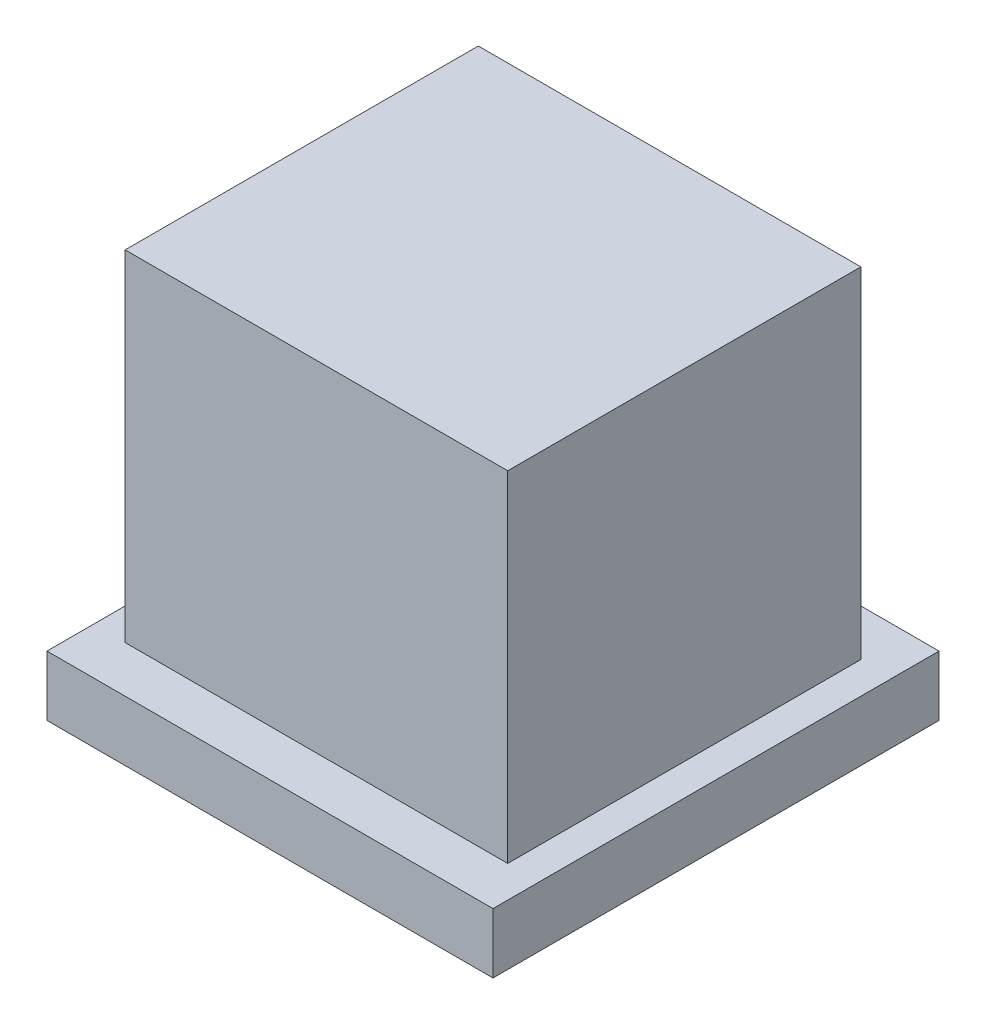
ISO-10303-21;
HEADER;
FILE_DESCRIPTION(('STEP AP214'),'2;1');
FILE_NAME('part.step','',(''),(''),'','','');
FILE_SCHEMA(('AUTOMOTIVE_DESIGN { 1 0 10303 214 1 1 1 1 }'));
ENDSEC;
DATA;
#1=APPLICATION_CONTEXT('core data for automotive mechanical design processes');
#2=APPLICATION_PROTOCOL_DEFINITION('international standard','automotive_design',2000,#1);
#3=PRODUCT_CONTEXT('',#1,'mechanical');
#4=PRODUCT('Part','Part','',(#3));
#5=PRODUCT_RELATED_PRODUCT_CATEGORY('part','',(#4));
#6=PRODUCT_DEFINITION_FORMATION('','',#4);
#7=PRODUCT_DEFINITION_CONTEXT('part definition',#1,'design');
#8=PRODUCT_DEFINITION('design','',#6,#7);
#9=PRODUCT_DEFINITION_SHAPE('','',#8);
#10=(LENGTH_UNIT() NAMED_UNIT(*) SI_UNIT(.MILLI.,.METRE.));
#11=(NAMED_UNIT(*) PLANE_ANGLE_UNIT() SI_UNIT($,.RADIAN.));
#12=(NAMED_UNIT(*) SI_UNIT($,.STERADIAN.) SOLID_ANGLE_UNIT());
#13=UNCERTAINTY_MEASURE_WITH_UNIT(LENGTH_MEASURE(1.E-05),#10,'distance_accuracy_value','');
#14=(GEOMETRIC_REPRESENTATION_CONTEXT(3) GLOBAL_UNCERTAINTY_ASSIGNED_CONTEXT((#13)) GLOBAL_UNIT_ASSIGNED_CONTEXT((#10,
#11,#12)) REPRESENTATION_CONTEXT('',''));
#15=CARTESIAN_POINT('',(0.,0.,0.));
#16=DIRECTION('',(0.,0.,1.));
#17=DIRECTION('',(1.,0.,0.));
#18=AXIS2_PLACEMENT_3D('',#15,#16,#17);
#19=CARTESIAN_POINT('',(0.,3.6322,0.));
#20=DIRECTION('',(1.,0.,0.));
#21=DIRECTION('',(0.,0.,-1.));
#22=AXIS2_PLACEMENT_3D('',#19,#20,#21);
#23=PLANE('',#22);
#24=DIRECTION('',(0.,0.,1.));
#25=VECTOR('',#24,1.);
#26=CARTESIAN_POINT('',(0.,0.,0.));
#27=LINE('',#26,#25);
#28=CARTESIAN_POINT('',(0.,0.,-26.9494));
#29=VERTEX_POINT('',#28);
#30=CARTESIAN_POINT('',(0.,0.,0.));
#31=VERTEX_POINT('',#30);
#32=EDGE_CURVE('E241',#29,#31,#27,.T.);
#33=ORIENTED_EDGE('',*,*,#32,.T.);
#34=DIRECTION('',(0.,-1.,0.));
#35=VECTOR('',#34,1.);
#36=CARTESIAN_POINT('',(0.,3.6322,0.));
#37=LINE('',#36,#35);
#38=CARTESIAN_POINT('',(0.,3.6322,0.));
#39=VERTEX_POINT('',#38);
#40=EDGE_CURVE('E11',#39,#31,#37,.T.);
#41=ORIENTED_EDGE('',*,*,#40,.F.);
#42=DIRECTION('',(0.,0.,1.));
#43=VECTOR('',#42,1.);
#44=CARTESIAN_POINT('',(0.,3.6322,0.));
#45=LINE('',#44,#43);
#46=CARTESIAN_POINT('',(0.,3.6322,-26.9494));
#47=VERTEX_POINT('',#46);
#48=EDGE_CURVE('E249',#47,#39,#45,.T.);
#49=ORIENTED_EDGE('',*,*,#48,.F.);
#50=DIRECTION('',(0.,-1.,0.));
#51=VECTOR('',#50,1.);
#52=CARTESIAN_POINT('',(0.,3.6322,-26.9494));
#53=LINE('',#52,#51);
#54=EDGE_CURVE('E259',#47,#29,#53,.T.);
#55=ORIENTED_EDGE('',*,*,#54,.T.);
#56=EDGE_LOOP('',(#33,#41,#49,#55));
#57=FACE_BOUND('',#56,.T.);
#58=ADVANCED_FACE('F32',(#57),#23,.F.);
#59=CARTESIAN_POINT('',(0.,3.6322,0.));
#60=DIRECTION('',(0.,0.,-1.));
#61=DIRECTION('',(-1.,0.,0.));
#62=AXIS2_PLACEMENT_3D('',#59,#60,#61);
#63=PLANE('',#62);
#64=DIRECTION('',(1.,0.,0.));
#65=VECTOR('',#64,1.);
#66=CARTESIAN_POINT('',(0.,0.,0.));
#67=LINE('',#66,#65);
#68=CARTESIAN_POINT('',(26.9494,0.,0.));
#69=VERTEX_POINT('',#68);
#70=EDGE_CURVE('E262',#31,#69,#67,.T.);
#71=ORIENTED_EDGE('',*,*,#70,.T.);
#72=DIRECTION('',(0.,-1.,0.));
#73=VECTOR('',#72,1.);
#74=CARTESIAN_POINT('',(26.9494,3.6322,0.));
#75=LINE('',#74,#73);
#76=CARTESIAN_POINT('',(26.9494,3.6322,0.));
#77=VERTEX_POINT('',#76);
#78=EDGE_CURVE('E39',#77,#69,#75,.T.);
#79=ORIENTED_EDGE('',*,*,#78,.F.);
#80=DIRECTION('',(1.,0.,0.));
#81=VECTOR('',#80,1.);
#82=CARTESIAN_POINT('',(0.,3.6322,0.));
#83=LINE('',#82,#81);
#84=EDGE_CURVE('E252',#39,#77,#83,.T.);
#85=ORIENTED_EDGE('',*,*,#84,.F.);
#86=ORIENTED_EDGE('',*,*,#40,.T.);
#87=EDGE_LOOP('',(#71,#79,#85,#86));
#88=FACE_BOUND('',#87,.T.);
#89=ADVANCED_FACE('F292',(#88),#63,.F.);
#90=CARTESIAN_POINT('',(26.9494,3.6322,0.));
#91=DIRECTION('',(-1.,0.,0.));
#92=DIRECTION('',(0.,0.,1.));
#93=AXIS2_PLACEMENT_3D('',#90,#91,#92);
#94=PLANE('',#93);
#95=DIRECTION('',(0.,0.,-1.));
#96=VECTOR('',#95,1.);
#97=CARTESIAN_POINT('',(26.9494,0.,0.));
#98=LINE('',#97,#96);
#99=CARTESIAN_POINT('',(26.9494,0.,-26.9494));
#100=VERTEX_POINT('',#99);
#101=EDGE_CURVE('E264',#69,#100,#98,.T.);
#102=ORIENTED_EDGE('',*,*,#101,.T.);
#103=DIRECTION('',(0.,-1.,0.));
#104=VECTOR('',#103,1.);
#105=CARTESIAN_POINT('',(26.9494,3.6322,-26.9494));
#106=LINE('',#105,#104);
#107=CARTESIAN_POINT('',(26.9494,3.6322,-26.9494));
#108=VERTEX_POINT('',#107);
#109=EDGE_CURVE('E269',#108,#100,#106,.T.);
#110=ORIENTED_EDGE('',*,*,#109,.F.);
#111=DIRECTION('',(0.,0.,-1.));
#112=VECTOR('',#111,1.);
#113=CARTESIAN_POINT('',(26.9494,3.6322,0.));
#114=LINE('',#113,#112);
#115=EDGE_CURVE('E255',#77,#108,#114,.T.);
#116=ORIENTED_EDGE('',*,*,#115,.F.);
#117=ORIENTED_EDGE('',*,*,#78,.T.);
#118=EDGE_LOOP('',(#102,#110,#116,#117));
#119=FACE_BOUND('',#118,.T.);
#120=ADVANCED_FACE('F276',(#119),#94,.F.);
#121=CARTESIAN_POINT('',(0.,3.6322,-26.9494));
#122=DIRECTION('',(0.,0.,1.));
#123=DIRECTION('',(1.,0.,0.));
#124=AXIS2_PLACEMENT_3D('',#121,#122,#123);
#125=PLANE('',#124);
#126=DIRECTION('',(-1.,0.,0.));
#127=VECTOR('',#126,1.);
#128=CARTESIAN_POINT('',(0.,0.,-26.9494));
#129=LINE('',#128,#127);
#130=EDGE_CURVE('E253',#100,#29,#129,.T.);
#131=ORIENTED_EDGE('',*,*,#130,.T.);
#132=ORIENTED_EDGE('',*,*,#54,.F.);
#133=DIRECTION('',(-1.,0.,0.));
#134=VECTOR('',#133,1.);
#135=CARTESIAN_POINT('',(0.,3.6322,-26.9494));
#136=LINE('',#135,#134);
#137=EDGE_CURVE('E257',#108,#47,#136,.T.);
#138=ORIENTED_EDGE('',*,*,#137,.F.);
#139=ORIENTED_EDGE('',*,*,#109,.T.);
#140=EDGE_LOOP('',(#131,#132,#138,#139));
#141=FACE_BOUND('',#140,.T.);
#142=ADVANCED_FACE('F285',(#141),#125,.F.);
#143=CARTESIAN_POINT('',(0.,3.6322,0.));
#144=DIRECTION('',(0.,-1.,0.));
#145=DIRECTION('',(0.,0.,-1.));
#146=AXIS2_PLACEMENT_3D('',#143,#144,#145);
#147=PLANE('',#146);
#148=DIRECTION('',(0.,0.,1.));
#149=VECTOR('',#148,1.);
#150=CARTESIAN_POINT('',(1.91769999999999,3.6322,-24.1427));
#151=LINE('',#150,#149);
#152=CARTESIAN_POINT('',(1.91769999999999,3.6322,-24.1427));
#153=VERTEX_POINT('',#152);
#154=CARTESIAN_POINT('',(1.9177,3.6322,-2.8067));
#155=VERTEX_POINT('',#154);
#156=EDGE_CURVE('E223',#153,#155,#151,.T.);
#157=ORIENTED_EDGE('',*,*,#156,.F.);
#158=DIRECTION('',(1.,0.,0.));
#159=VECTOR('',#158,1.);
#160=CARTESIAN_POINT('',(1.91769999999999,3.6322,-24.1427));
#161=LINE('',#160,#159);
#162=CARTESIAN_POINT('',(25.0317,3.6322,-24.1427));
#163=VERTEX_POINT('',#162);
#164=EDGE_CURVE('E213',#153,#163,#161,.T.);
#165=ORIENTED_EDGE('',*,*,#164,.T.);
#166=DIRECTION('',(0.,0.,1.));
#167=VECTOR('',#166,1.);
#168=CARTESIAN_POINT('',(25.0317,3.6322,-24.1427));
#169=LINE('',#168,#167);
#170=CARTESIAN_POINT('',(25.0317,3.6322,-2.8067));
#171=VERTEX_POINT('',#170);
#172=EDGE_CURVE('E233',#163,#171,#169,.T.);
#173=ORIENTED_EDGE('',*,*,#172,.T.);
#174=DIRECTION('',(1.,0.,0.));
#175=VECTOR('',#174,1.);
#176=CARTESIAN_POINT('',(1.9177,3.6322,-2.8067));
#177=LINE('',#176,#175);
#178=EDGE_CURVE('E236',#155,#171,#177,.T.);
#179=ORIENTED_EDGE('',*,*,#178,.F.);
#180=EDGE_LOOP('',(#157,#165,#173,#179));
#181=FACE_BOUND('',#180,.T.);
#182=ORIENTED_EDGE('',*,*,#48,.T.);
#183=ORIENTED_EDGE('',*,*,#84,.T.);
#184=ORIENTED_EDGE('',*,*,#115,.T.);
#185=ORIENTED_EDGE('',*,*,#137,.T.);
#186=EDGE_LOOP('',(#182,#183,#184,#185));
#187=FACE_BOUND('',#186,.T.);
#188=ADVANCED_FACE('F291',(#181,#187),#147,.F.);
#189=CARTESIAN_POINT('',(0.,0.,0.));
#190=DIRECTION('',(0.,-1.,0.));
#191=DIRECTION('',(0.,0.,-1.));
#192=AXIS2_PLACEMENT_3D('',#189,#190,#191);
#193=PLANE('',#192);
#194=DIRECTION('',(-1.,0.,0.));
#195=VECTOR('',#194,1.);
#196=CARTESIAN_POINT('',(20.8858648150999,0.,-4.4342012986931));
#197=LINE('',#196,#195);
#198=CARTESIAN_POINT('',(20.8858648150999,0.,-4.4342012986931));
#199=VERTEX_POINT('',#198);
#200=CARTESIAN_POINT('',(17.8417639713407,0.,-4.4342012986931));
#201=VERTEX_POINT('',#200);
#202=EDGE_CURVE('E46',#199,#201,#197,.T.);
#203=ORIENTED_EDGE('',*,*,#202,.F.);
#204=DIRECTION('',(0.,0.,1.));
#205=VECTOR('',#204,1.);
#206=CARTESIAN_POINT('',(20.8858648150999,0.,-4.4342012986931));
#207=LINE('',#206,#205);
#208=CARTESIAN_POINT('',(20.8858648150999,0.,-14.10682299732));
#209=VERTEX_POINT('',#208);
#210=EDGE_CURVE('E164',#209,#199,#207,.T.);
#211=ORIENTED_EDGE('',*,*,#210,.F.);
#212=DIRECTION('',(1.,0.,0.));
#213=VECTOR('',#212,1.);
#214=CARTESIAN_POINT('',(20.8858648150999,0.,-14.10682299732));
#215=LINE('',#214,#213);
#216=CARTESIAN_POINT('',(17.8417639713407,0.,-14.10682299732));
#217=VERTEX_POINT('',#216);
#218=EDGE_CURVE('E167',#217,#209,#215,.T.);
#219=ORIENTED_EDGE('',*,*,#218,.F.);
#220=DIRECTION('',(0.,0.,-1.));
#221=VECTOR('',#220,1.);
#222=CARTESIAN_POINT('',(17.8417639713407,0.,-4.4342012986931));
#223=LINE('',#222,#221);
#224=EDGE_CURVE('E173',#201,#217,#223,.T.);
#225=ORIENTED_EDGE('',*,*,#224,.F.);
#226=EDGE_LOOP('',(#203,#211,#219,#225));
#227=FACE_BOUND('',#226,.T.);
#228=CARTESIAN_POINT('',(13.4747,0.,-19.7964729054831));
#229=DIRECTION('',(0.,-1.,0.));
#230=DIRECTION('',(0.,0.,-1.));
#231=AXIS2_PLACEMENT_3D('',#228,#229,#230);
#232=CIRCLE('',#231,2.26691967960267);
#233=CARTESIAN_POINT('',(13.4747,0.,-22.0633925850858));
#234=VERTEX_POINT('',#233);
#235=EDGE_CURVE('E185',#234,#234,#232,.T.);
#236=ORIENTED_EDGE('',*,*,#235,.F.);
#237=EDGE_LOOP('',(#236));
#238=FACE_BOUND('',#237,.T.);
#239=DIRECTION('',(0.,0.,-1.));
#240=VECTOR('',#239,1.);
#241=CARTESIAN_POINT('',(6.0635351849001,0.,-4.4342012986931));
#242=LINE('',#241,#240);
#243=CARTESIAN_POINT('',(6.0635351849001,0.,-4.4342012986931));
#244=VERTEX_POINT('',#243);
#245=CARTESIAN_POINT('',(6.0635351849001,0.,-14.10682299732));
#246=VERTEX_POINT('',#245);
#247=EDGE_CURVE('E54',#244,#246,#242,.T.);
#248=ORIENTED_EDGE('',*,*,#247,.F.);
#249=DIRECTION('',(-1.,0.,0.));
#250=VECTOR('',#249,1.);
#251=CARTESIAN_POINT('',(6.0635351849001,0.,-4.4342012986931));
#252=LINE('',#251,#250);
#253=CARTESIAN_POINT('',(9.10763602865927,0.,-4.4342012986931));
#254=VERTEX_POINT('',#253);
#255=EDGE_CURVE('E192',#254,#244,#252,.T.);
#256=ORIENTED_EDGE('',*,*,#255,.F.);
#257=DIRECTION('',(0.,0.,1.));
#258=VECTOR('',#257,1.);
#259=CARTESIAN_POINT('',(9.10763602865927,0.,-4.4342012986931));
#260=LINE('',#259,#258);
#261=CARTESIAN_POINT('',(9.10763602865927,0.,-14.10682299732));
#262=VERTEX_POINT('',#261);
#263=EDGE_CURVE('E206',#262,#254,#260,.T.);
#264=ORIENTED_EDGE('',*,*,#263,.F.);
#265=DIRECTION('',(1.,0.,0.));
#266=VECTOR('',#265,1.);
#267=CARTESIAN_POINT('',(6.0635351849001,0.,-14.10682299732));
#268=LINE('',#267,#266);
#269=EDGE_CURVE('E203',#246,#262,#268,.T.);
#270=ORIENTED_EDGE('',*,*,#269,.F.);
#271=EDGE_LOOP('',(#248,#256,#264,#270));
#272=FACE_BOUND('',#271,.T.);
#273=ORIENTED_EDGE('',*,*,#32,.F.);
#274=ORIENTED_EDGE('',*,*,#130,.F.);
#275=ORIENTED_EDGE('',*,*,#101,.F.);
#276=ORIENTED_EDGE('',*,*,#70,.F.);
#277=EDGE_LOOP('',(#273,#274,#275,#276));
#278=FACE_BOUND('',#277,.T.);
#279=ADVANCED_FACE('F282',(#227,#238,#272,#278),#193,.T.);
#280=CARTESIAN_POINT('',(1.91769999999999,24.1808,-24.1427));
#281=DIRECTION('',(0.,0.,-1.));
#282=DIRECTION('',(-1.,0.,0.));
#283=AXIS2_PLACEMENT_3D('',#280,#281,#282);
#284=PLANE('',#283);
#285=ORIENTED_EDGE('',*,*,#164,.F.);
#286=DIRECTION('',(0.,-1.,0.));
#287=VECTOR('',#286,1.);
#288=CARTESIAN_POINT('',(1.91769999999999,24.1808,-24.1427));
#289=LINE('',#288,#287);
#290=CARTESIAN_POINT('',(1.91769999999999,24.1808,-24.1427));
#291=VERTEX_POINT('',#290);
#292=EDGE_CURVE('E239',#291,#153,#289,.T.);
#293=ORIENTED_EDGE('',*,*,#292,.F.);
#294=DIRECTION('',(1.,0.,0.));
#295=VECTOR('',#294,1.);
#296=CARTESIAN_POINT('',(1.91769999999999,24.1808,-24.1427));
#297=LINE('',#296,#295);
#298=CARTESIAN_POINT('',(25.0317,24.1808,-24.1427));
#299=VERTEX_POINT('',#298);
#300=EDGE_CURVE('E219',#291,#299,#297,.T.);
#301=ORIENTED_EDGE('',*,*,#300,.T.);
#302=DIRECTION('',(0.,-1.,0.));
#303=VECTOR('',#302,1.);
#304=CARTESIAN_POINT('',(25.0317,24.1808,-24.1427));
#305=LINE('',#304,#303);
#306=EDGE_CURVE('E230',#299,#163,#305,.T.);
#307=ORIENTED_EDGE('',*,*,#306,.T.);
#308=EDGE_LOOP('',(#285,#293,#301,#307));
#309=FACE_BOUND('',#308,.T.);
#310=ADVANCED_FACE('F304',(#309),#284,.T.);
#311=CARTESIAN_POINT('',(1.91769999999999,24.1808,-24.1427));
#312=DIRECTION('',(1.,0.,0.));
#313=DIRECTION('',(0.,0.,-1.));
#314=AXIS2_PLACEMENT_3D('',#311,#312,#313);
#315=PLANE('',#314);
#316=ORIENTED_EDGE('',*,*,#156,.T.);
#317=DIRECTION('',(0.,-1.,0.));
#318=VECTOR('',#317,1.);
#319=CARTESIAN_POINT('',(1.9177,24.1808,-2.8067));
#320=LINE('',#319,#318);
#321=CARTESIAN_POINT('',(1.9177,24.1808,-2.8067));
#322=VERTEX_POINT('',#321);
#323=EDGE_CURVE('E242',#322,#155,#320,.T.);
#324=ORIENTED_EDGE('',*,*,#323,.F.);
#325=DIRECTION('',(0.,0.,1.));
#326=VECTOR('',#325,1.);
#327=CARTESIAN_POINT('',(1.91769999999999,24.1808,-24.1427));
#328=LINE('',#327,#326);
#329=EDGE_CURVE('E228',#291,#322,#328,.T.);
#330=ORIENTED_EDGE('',*,*,#329,.F.);
#331=ORIENTED_EDGE('',*,*,#292,.T.);
#332=EDGE_LOOP('',(#316,#324,#330,#331));
#333=FACE_BOUND('',#332,.T.);
#334=ADVANCED_FACE('F311',(#333),#315,.F.);
#335=CARTESIAN_POINT('',(1.9177,24.1808,-2.8067));
#336=DIRECTION('',(0.,0.,-1.));
#337=DIRECTION('',(-1.,0.,0.));
#338=AXIS2_PLACEMENT_3D('',#335,#336,#337);
#339=PLANE('',#338);
#340=ORIENTED_EDGE('',*,*,#178,.T.);
#341=DIRECTION('',(0.,-1.,0.));
#342=VECTOR('',#341,1.);
#343=CARTESIAN_POINT('',(25.0317,24.1808,-2.8067));
#344=LINE('',#343,#342);
#345=CARTESIAN_POINT('',(25.0317,24.1808,-2.8067));
#346=VERTEX_POINT('',#345);
#347=EDGE_CURVE('E245',#346,#171,#344,.T.);
#348=ORIENTED_EDGE('',*,*,#347,.F.);
#349=DIRECTION('',(1.,0.,0.));
#350=VECTOR('',#349,1.);
#351=CARTESIAN_POINT('',(1.9177,24.1808,-2.8067));
#352=LINE('',#351,#350);
#353=EDGE_CURVE('E226',#322,#346,#352,.T.);
#354=ORIENTED_EDGE('',*,*,#353,.F.);
#355=ORIENTED_EDGE('',*,*,#323,.T.);
#356=EDGE_LOOP('',(#340,#348,#354,#355));
#357=FACE_BOUND('',#356,.T.);
#358=ADVANCED_FACE('F317',(#357),#339,.F.);
#359=CARTESIAN_POINT('',(25.0317,24.1808,-24.1427));
#360=DIRECTION('',(1.,0.,0.));
#361=DIRECTION('',(0.,0.,-1.));
#362=AXIS2_PLACEMENT_3D('',#359,#360,#361);
#363=PLANE('',#362);
#364=ORIENTED_EDGE('',*,*,#172,.F.);
#365=ORIENTED_EDGE('',*,*,#306,.F.);
#366=DIRECTION('',(0.,0.,1.));
#367=VECTOR('',#366,1.);
#368=CARTESIAN_POINT('',(25.0317,24.1808,-24.1427));
#369=LINE('',#368,#367);
#370=EDGE_CURVE('E222',#299,#346,#369,.T.);
#371=ORIENTED_EDGE('',*,*,#370,.T.);
#372=ORIENTED_EDGE('',*,*,#347,.T.);
#373=EDGE_LOOP('',(#364,#365,#371,#372));
#374=FACE_BOUND('',#373,.T.);
#375=ADVANCED_FACE('F313',(#374),#363,.T.);
#376=CARTESIAN_POINT('',(0.,24.1808,0.));
#377=DIRECTION('',(0.,-1.,0.));
#378=DIRECTION('',(0.,0.,-1.));
#379=AXIS2_PLACEMENT_3D('',#376,#377,#378);
#380=PLANE('',#379);
#381=ORIENTED_EDGE('',*,*,#300,.F.);
#382=ORIENTED_EDGE('',*,*,#329,.T.);
#383=ORIENTED_EDGE('',*,*,#353,.T.);
#384=ORIENTED_EDGE('',*,*,#370,.F.);
#385=EDGE_LOOP('',(#381,#382,#383,#384));
#386=FACE_BOUND('',#385,.T.);
#387=ADVANCED_FACE('F316',(#386),#380,.F.);
#388=CARTESIAN_POINT('',(6.0635351849001,5.,-4.4342012986931));
#389=DIRECTION('',(-1.,0.,0.));
#390=DIRECTION('',(0.,0.,1.));
#391=AXIS2_PLACEMENT_3D('',#388,#389,#390);
#392=PLANE('',#391);
#393=ORIENTED_EDGE('',*,*,#247,.T.);
#394=DIRECTION('',(0.,-1.,0.));
#395=VECTOR('',#394,1.);
#396=CARTESIAN_POINT('',(6.0635351849001,5.,-14.10682299732));
#397=LINE('',#396,#395);
#398=CARTESIAN_POINT('',(6.0635351849001,5.,-14.10682299732));
#399=VERTEX_POINT('',#398);
#400=EDGE_CURVE('E201',#399,#246,#397,.T.);
#401=ORIENTED_EDGE('',*,*,#400,.F.);
#402=DIRECTION('',(0.,0.,-1.));
#403=VECTOR('',#402,1.);
#404=CARTESIAN_POINT('',(6.0635351849001,5.,-4.4342012986931));
#405=LINE('',#404,#403);
#406=CARTESIAN_POINT('',(6.0635351849001,5.,-4.4342012986931));
#407=VERTEX_POINT('',#406);
#408=EDGE_CURVE('E188',#407,#399,#405,.T.);
#409=ORIENTED_EDGE('',*,*,#408,.F.);
#410=DIRECTION('',(0.,-1.,0.));
#411=VECTOR('',#410,1.);
#412=CARTESIAN_POINT('',(6.0635351849001,5.,-4.4342012986931));
#413=LINE('',#412,#411);
#414=EDGE_CURVE('E211',#407,#244,#413,.T.);
#415=ORIENTED_EDGE('',*,*,#414,.T.);
#416=EDGE_LOOP('',(#393,#401,#409,#415));
#417=FACE_BOUND('',#416,.T.);
#418=ADVANCED_FACE('F327',(#417),#392,.F.);
#419=CARTESIAN_POINT('',(6.0635351849001,5.,-4.4342012986931));
#420=DIRECTION('',(0.,0.,1.));
#421=DIRECTION('',(1.,0.,0.));
#422=AXIS2_PLACEMENT_3D('',#419,#420,#421);
#423=PLANE('',#422);
#424=ORIENTED_EDGE('',*,*,#255,.T.);
#425=ORIENTED_EDGE('',*,*,#414,.F.);
#426=DIRECTION('',(-1.,0.,0.));
#427=VECTOR('',#426,1.);
#428=CARTESIAN_POINT('',(6.0635351849001,5.,-4.4342012986931));
#429=LINE('',#428,#427);
#430=CARTESIAN_POINT('',(9.10763602865927,5.,-4.4342012986931));
#431=VERTEX_POINT('',#430);
#432=EDGE_CURVE('E198',#431,#407,#429,.T.);
#433=ORIENTED_EDGE('',*,*,#432,.F.);
#434=DIRECTION('',(0.,-1.,0.));
#435=VECTOR('',#434,1.);
#436=CARTESIAN_POINT('',(9.10763602865927,5.,-4.4342012986931));
#437=LINE('',#436,#435);
#438=EDGE_CURVE('E214',#431,#254,#437,.T.);
#439=ORIENTED_EDGE('',*,*,#438,.T.);
#440=EDGE_LOOP('',(#424,#425,#433,#439));
#441=FACE_BOUND('',#440,.T.);
#442=ADVANCED_FACE('F331',(#441),#423,.F.);
#443=CARTESIAN_POINT('',(9.10763602865927,5.,-4.4342012986931));
#444=DIRECTION('',(1.,0.,0.));
#445=DIRECTION('',(0.,0.,-1.));
#446=AXIS2_PLACEMENT_3D('',#443,#444,#445);
#447=PLANE('',#446);
#448=ORIENTED_EDGE('',*,*,#263,.T.);
#449=ORIENTED_EDGE('',*,*,#438,.F.);
#450=DIRECTION('',(0.,0.,1.));
#451=VECTOR('',#450,1.);
#452=CARTESIAN_POINT('',(9.10763602865927,5.,-4.4342012986931));
#453=LINE('',#452,#451);
#454=CARTESIAN_POINT('',(9.10763602865927,5.,-14.10682299732));
#455=VERTEX_POINT('',#454);
#456=EDGE_CURVE('E195',#455,#431,#453,.T.);
#457=ORIENTED_EDGE('',*,*,#456,.F.);
#458=DIRECTION('',(0.,-1.,0.));
#459=VECTOR('',#458,1.);
#460=CARTESIAN_POINT('',(9.10763602865927,5.,-14.10682299732));
#461=LINE('',#460,#459);
#462=EDGE_CURVE('E216',#455,#262,#461,.T.);
#463=ORIENTED_EDGE('',*,*,#462,.T.);
#464=EDGE_LOOP('',(#448,#449,#457,#463));
#465=FACE_BOUND('',#464,.T.);
#466=ADVANCED_FACE('F336',(#465),#447,.F.);
#467=CARTESIAN_POINT('',(6.0635351849001,5.,-14.10682299732));
#468=DIRECTION('',(0.,0.,-1.));
#469=DIRECTION('',(-1.,0.,0.));
#470=AXIS2_PLACEMENT_3D('',#467,#468,#469);
#471=PLANE('',#470);
#472=ORIENTED_EDGE('',*,*,#269,.T.);
#473=ORIENTED_EDGE('',*,*,#462,.F.);
#474=DIRECTION('',(1.,0.,0.));
#475=VECTOR('',#474,1.);
#476=CARTESIAN_POINT('',(6.0635351849001,5.,-14.10682299732));
#477=LINE('',#476,#475);
#478=EDGE_CURVE('E191',#399,#455,#477,.T.);
#479=ORIENTED_EDGE('',*,*,#478,.F.);
#480=ORIENTED_EDGE('',*,*,#400,.T.);
#481=EDGE_LOOP('',(#472,#473,#479,#480));
#482=FACE_BOUND('',#481,.T.);
#483=ADVANCED_FACE('F332',(#482),#471,.F.);
#484=CARTESIAN_POINT('',(0.,5.,0.));
#485=DIRECTION('',(0.,-1.,0.));
#486=DIRECTION('',(0.,0.,-1.));
#487=AXIS2_PLACEMENT_3D('',#484,#485,#486);
#488=PLANE('',#487);
#489=ORIENTED_EDGE('',*,*,#408,.T.);
#490=ORIENTED_EDGE('',*,*,#478,.T.);
#491=ORIENTED_EDGE('',*,*,#456,.T.);
#492=ORIENTED_EDGE('',*,*,#432,.T.);
#493=EDGE_LOOP('',(#489,#490,#491,#492));
#494=FACE_BOUND('',#493,.T.);
#495=ADVANCED_FACE('F335',(#494),#488,.T.);
#496=CARTESIAN_POINT('',(13.4747,5.,-19.7964729054831));
#497=DIRECTION('',(0.,-1.,0.));
#498=DIRECTION('',(0.,0.,-1.));
#499=AXIS2_PLACEMENT_3D('',#496,#497,#498);
#500=CYLINDRICAL_SURFACE('',#499,2.26691967960267);
#501=CARTESIAN_POINT('',(13.4747,5.,-19.7964729054831));
#502=DIRECTION('',(0.,-1.,0.));
#503=DIRECTION('',(0.,0.,-1.));
#504=AXIS2_PLACEMENT_3D('',#501,#502,#503);
#505=CIRCLE('',#504,2.26691967960267);
#506=CARTESIAN_POINT('',(13.4747,5.,-22.0633925850858));
#507=VERTEX_POINT('',#506);
#508=EDGE_CURVE('E174',#507,#507,#505,.T.);
#509=ORIENTED_EDGE('',*,*,#508,.F.);
#510=EDGE_LOOP('',(#509));
#511=FACE_BOUND('',#510,.T.);
#512=ORIENTED_EDGE('',*,*,#235,.T.);
#513=EDGE_LOOP('',(#512));
#514=FACE_BOUND('',#513,.T.);
#515=ADVANCED_FACE('F346',(#511,#514),#500,.F.);
#516=CARTESIAN_POINT('',(13.4747,5.,-19.7964729054831));
#517=DIRECTION('',(0.,-1.,0.));
#518=DIRECTION('',(0.,0.,-1.));
#519=AXIS2_PLACEMENT_3D('',#516,#517,#518);
#520=PLANE('',#519);
#521=ORIENTED_EDGE('',*,*,#508,.T.);
#522=EDGE_LOOP('',(#521));
#523=FACE_BOUND('',#522,.T.);
#524=ADVANCED_FACE('F350',(#523),#520,.T.);
#525=CARTESIAN_POINT('',(20.8858648150999,5.,-4.4342012986931));
#526=DIRECTION('',(0.,0.,1.));
#527=DIRECTION('',(1.,0.,0.));
#528=AXIS2_PLACEMENT_3D('',#525,#526,#527);
#529=PLANE('',#528);
#530=ORIENTED_EDGE('',*,*,#202,.T.);
#531=DIRECTION('',(0.,-1.,0.));
#532=VECTOR('',#531,1.);
#533=CARTESIAN_POINT('',(17.8417639713407,5.,-4.4342012986931));
#534=LINE('',#533,#532);
#535=CARTESIAN_POINT('',(17.8417639713407,5.,-4.4342012986931));
#536=VERTEX_POINT('',#535);
#537=EDGE_CURVE('E142',#536,#201,#534,.T.);
#538=ORIENTED_EDGE('',*,*,#537,.F.);
#539=DIRECTION('',(-1.,0.,0.));
#540=VECTOR('',#539,1.);
#541=CARTESIAN_POINT('',(20.8858648150999,5.,-4.4342012986931));
#542=LINE('',#541,#540);
#543=CARTESIAN_POINT('',(20.8858648150999,5.,-4.4342012986931));
#544=VERTEX_POINT('',#543);
#545=EDGE_CURVE('E146',#544,#536,#542,.T.);
#546=ORIENTED_EDGE('',*,*,#545,.F.);
#547=DIRECTION('',(0.,-1.,0.));
#548=VECTOR('',#547,1.);
#549=CARTESIAN_POINT('',(20.8858648150999,5.,-4.4342012986931));
#550=LINE('',#549,#548);
#551=EDGE_CURVE('E178',#544,#199,#550,.T.);
#552=ORIENTED_EDGE('',*,*,#551,.T.);
#553=EDGE_LOOP('',(#530,#538,#546,#552));
#554=FACE_BOUND('',#553,.T.);
#555=ADVANCED_FACE('F144',(#554),#529,.F.);
#556=CARTESIAN_POINT('',(20.8858648150999,5.,-4.4342012986931));
#557=DIRECTION('',(1.,0.,0.));
#558=DIRECTION('',(0.,0.,-1.));
#559=AXIS2_PLACEMENT_3D('',#556,#557,#558);
#560=PLANE('',#559);
#561=ORIENTED_EDGE('',*,*,#210,.T.);
#562=ORIENTED_EDGE('',*,*,#551,.F.);
#563=DIRECTION('',(0.,0.,1.));
#564=VECTOR('',#563,1.);
#565=CARTESIAN_POINT('',(20.8858648150999,5.,-4.4342012986931));
#566=LINE('',#565,#564);
#567=CARTESIAN_POINT('',(20.8858648150999,5.,-14.10682299732));
#568=VERTEX_POINT('',#567);
#569=EDGE_CURVE('E152',#568,#544,#566,.T.);
#570=ORIENTED_EDGE('',*,*,#569,.F.);
#571=DIRECTION('',(0.,-1.,0.));
#572=VECTOR('',#571,1.);
#573=CARTESIAN_POINT('',(20.8858648150999,5.,-14.10682299732));
#574=LINE('',#573,#572);
#575=EDGE_CURVE('E180',#568,#209,#574,.T.);
#576=ORIENTED_EDGE('',*,*,#575,.T.);
#577=EDGE_LOOP('',(#561,#562,#570,#576));
#578=FACE_BOUND('',#577,.T.);
#579=ADVANCED_FACE('F357',(#578),#560,.F.);
#580=CARTESIAN_POINT('',(20.8858648150999,5.,-14.10682299732));
#581=DIRECTION('',(0.,0.,-1.));
#582=DIRECTION('',(-1.,0.,0.));
#583=AXIS2_PLACEMENT_3D('',#580,#581,#582);
#584=PLANE('',#583);
#585=ORIENTED_EDGE('',*,*,#218,.T.);
#586=ORIENTED_EDGE('',*,*,#575,.F.);
#587=DIRECTION('',(1.,0.,0.));
#588=VECTOR('',#587,1.);
#589=CARTESIAN_POINT('',(20.8858648150999,5.,-14.10682299732));
#590=LINE('',#589,#588);
#591=CARTESIAN_POINT('',(17.8417639713407,5.,-14.10682299732));
#592=VERTEX_POINT('',#591);
#593=EDGE_CURVE('E160',#592,#568,#590,.T.);
#594=ORIENTED_EDGE('',*,*,#593,.F.);
#595=DIRECTION('',(0.,-1.,0.));
#596=VECTOR('',#595,1.);
#597=CARTESIAN_POINT('',(17.8417639713407,5.,-14.10682299732));
#598=LINE('',#597,#596);
#599=EDGE_CURVE('E151',#592,#217,#598,.T.);
#600=ORIENTED_EDGE('',*,*,#599,.T.);
#601=EDGE_LOOP('',(#585,#586,#594,#600));
#602=FACE_BOUND('',#601,.T.);
#603=ADVANCED_FACE('F360',(#602),#584,.F.);
#604=CARTESIAN_POINT('',(17.8417639713407,5.,-4.4342012986931));
#605=DIRECTION('',(-1.,0.,0.));
#606=DIRECTION('',(0.,0.,1.));
#607=AXIS2_PLACEMENT_3D('',#604,#605,#606);
#608=PLANE('',#607);
#609=ORIENTED_EDGE('',*,*,#224,.T.);
#610=ORIENTED_EDGE('',*,*,#599,.F.);
#611=DIRECTION('',(0.,0.,-1.));
#612=VECTOR('',#611,1.);
#613=CARTESIAN_POINT('',(17.8417639713407,5.,-4.4342012986931));
#614=LINE('',#613,#612);
#615=EDGE_CURVE('E155',#536,#592,#614,.T.);
#616=ORIENTED_EDGE('',*,*,#615,.F.);
#617=ORIENTED_EDGE('',*,*,#537,.T.);
#618=EDGE_LOOP('',(#609,#610,#616,#617));
#619=FACE_BOUND('',#618,.T.);
#620=ADVANCED_FACE('F156',(#619),#608,.F.);
#621=CARTESIAN_POINT('',(0.,5.,0.));
#622=DIRECTION('',(0.,-1.,0.));
#623=DIRECTION('',(0.,0.,-1.));
#624=AXIS2_PLACEMENT_3D('',#621,#622,#623);
#625=PLANE('',#624);
#626=ORIENTED_EDGE('',*,*,#545,.T.);
#627=ORIENTED_EDGE('',*,*,#615,.T.);
#628=ORIENTED_EDGE('',*,*,#593,.T.);
#629=ORIENTED_EDGE('',*,*,#569,.T.);
#630=EDGE_LOOP('',(#626,#627,#628,#629));
#631=FACE_BOUND('',#630,.T.);
#632=ADVANCED_FACE('F162',(#631),#625,.T.);
#633=CLOSED_SHELL('',(#58,#89,#120,#142,#188,#279,#310,#334,#358,#375,#387,#418,#442,#466,#483,
#495,#515,#524,#555,#579,#603,#620,#632));
#634=MANIFOLD_SOLID_BREP('B2',#633);
#635=ADVANCED_BREP_SHAPE_REPRESENTATION('',(#18,#634),#14);
#636=SHAPE_DEFINITION_REPRESENTATION(#9,#635);
ENDSEC;
END-ISO-10303-21;
